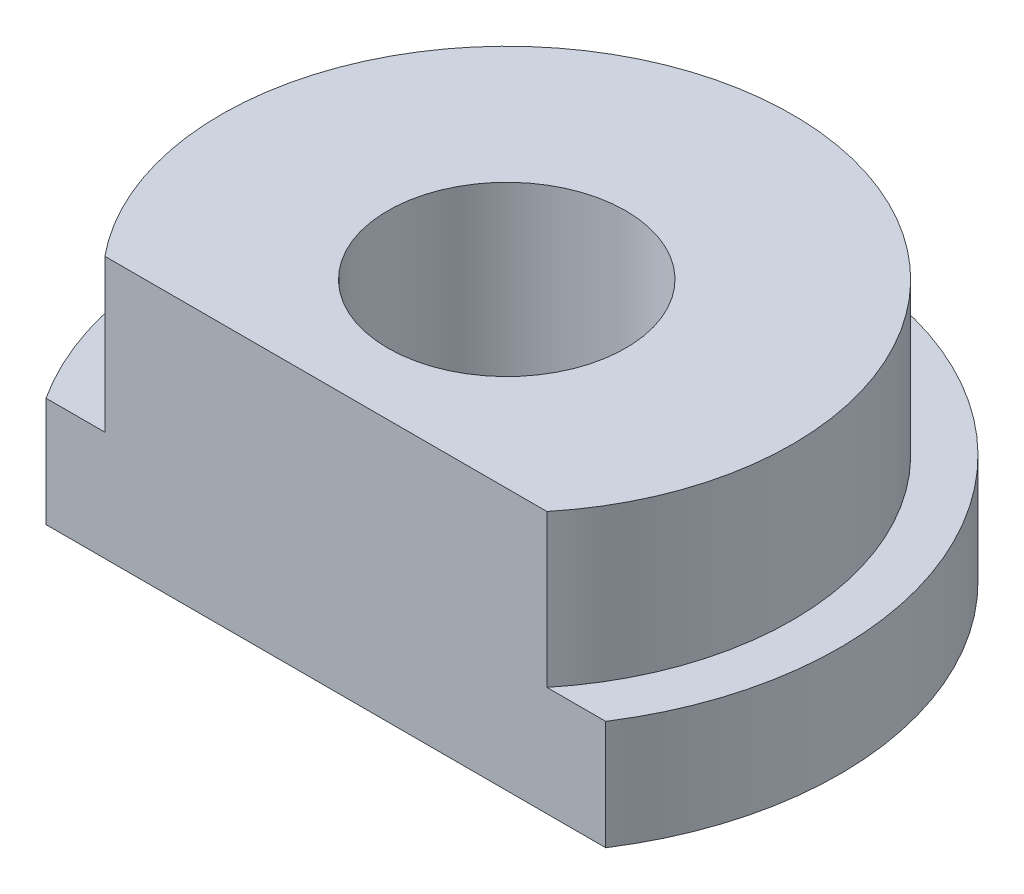
ISO-10303-21;
HEADER;
FILE_DESCRIPTION(('STEP AP214'),'2;1');
FILE_NAME('part.step','',(''),(''),'','','');
FILE_SCHEMA(('AUTOMOTIVE_DESIGN { 1 0 10303 214 1 1 1 1 }'));
ENDSEC;
DATA;
#1=APPLICATION_CONTEXT('core data for automotive mechanical design processes');
#2=APPLICATION_PROTOCOL_DEFINITION('international standard','automotive_design',2000,#1);
#3=PRODUCT_CONTEXT('',#1,'mechanical');
#4=PRODUCT('Part','Part','',(#3));
#5=PRODUCT_RELATED_PRODUCT_CATEGORY('part','',(#4));
#6=PRODUCT_DEFINITION_FORMATION('','',#4);
#7=PRODUCT_DEFINITION_CONTEXT('part definition',#1,'design');
#8=PRODUCT_DEFINITION('design','',#6,#7);
#9=PRODUCT_DEFINITION_SHAPE('','',#8);
#10=(LENGTH_UNIT() NAMED_UNIT(*) SI_UNIT(.MILLI.,.METRE.));
#11=(NAMED_UNIT(*) PLANE_ANGLE_UNIT() SI_UNIT($,.RADIAN.));
#12=(NAMED_UNIT(*) SI_UNIT($,.STERADIAN.) SOLID_ANGLE_UNIT());
#13=UNCERTAINTY_MEASURE_WITH_UNIT(LENGTH_MEASURE(1.E-05),#10,'distance_accuracy_value','');
#14=(GEOMETRIC_REPRESENTATION_CONTEXT(3) GLOBAL_UNCERTAINTY_ASSIGNED_CONTEXT((#13)) GLOBAL_UNIT_ASSIGNED_CONTEXT((#10,
#11,#12)) REPRESENTATION_CONTEXT('',''));
#15=CARTESIAN_POINT('',(0.,0.,0.));
#16=DIRECTION('',(0.,0.,1.));
#17=DIRECTION('',(1.,0.,0.));
#18=AXIS2_PLACEMENT_3D('',#15,#16,#17);
#19=CARTESIAN_POINT('',(3.5,0.,0.));
#20=DIRECTION('',(0.,-1.,0.));
#21=DIRECTION('',(0.,0.,-1.));
#22=AXIS2_PLACEMENT_3D('',#19,#20,#21);
#23=PLANE('',#22);
#24=DIRECTION('',(-1.,0.,0.));
#25=VECTOR('',#24,1.);
#26=CARTESIAN_POINT('',(-2.93938769133981,0.,1.9));
#27=LINE('',#26,#25);
#28=CARTESIAN_POINT('',(2.93938769133981,0.,1.9));
#29=VERTEX_POINT('',#28);
#30=CARTESIAN_POINT('',(-2.93938769133981,0.,1.9));
#31=VERTEX_POINT('',#30);
#32=EDGE_CURVE('E69',#29,#31,#27,.T.);
#33=ORIENTED_EDGE('',*,*,#32,.T.);
#34=CARTESIAN_POINT('',(0.,0.,0.));
#35=DIRECTION('',(0.,-1.,0.));
#36=DIRECTION('',(0.,0.,-1.));
#37=AXIS2_PLACEMENT_3D('',#34,#35,#36);
#38=CIRCLE('',#37,3.5);
#39=EDGE_CURVE('E82',#31,#29,#38,.T.);
#40=ORIENTED_EDGE('',*,*,#39,.T.);
#41=EDGE_LOOP('',(#33,#40));
#42=FACE_BOUND('',#41,.T.);
#43=CARTESIAN_POINT('',(0.,0.,0.));
#44=DIRECTION('',(0.,-1.,0.));
#45=DIRECTION('',(0.,0.,-1.));
#46=AXIS2_PLACEMENT_3D('',#43,#44,#45);
#47=CIRCLE('',#46,1.25);
#48=CARTESIAN_POINT('',(0.,0.,-1.25));
#49=VERTEX_POINT('',#48);
#50=EDGE_CURVE('E11',#49,#49,#47,.T.);
#51=ORIENTED_EDGE('',*,*,#50,.F.);
#52=EDGE_LOOP('',(#51));
#53=FACE_BOUND('',#52,.T.);
#54=ADVANCED_FACE('F32',(#42,#53),#23,.T.);
#55=CARTESIAN_POINT('',(0.,0.,0.));
#56=DIRECTION('',(0.,-1.,0.));
#57=DIRECTION('',(0.,0.,-1.));
#58=AXIS2_PLACEMENT_3D('',#55,#56,#57);
#59=CYLINDRICAL_SURFACE('',#58,1.25);
#60=ORIENTED_EDGE('',*,*,#50,.T.);
#61=EDGE_LOOP('',(#60));
#62=FACE_BOUND('',#61,.T.);
#63=CARTESIAN_POINT('',(0.,2.75,0.));
#64=DIRECTION('',(0.,-1.,0.));
#65=DIRECTION('',(0.,0.,-1.));
#66=AXIS2_PLACEMENT_3D('',#63,#64,#65);
#67=CIRCLE('',#66,1.25);
#68=CARTESIAN_POINT('',(0.,2.75,-1.25));
#69=VERTEX_POINT('',#68);
#70=EDGE_CURVE('E39',#69,#69,#67,.T.);
#71=ORIENTED_EDGE('',*,*,#70,.F.);
#72=EDGE_LOOP('',(#71));
#73=FACE_BOUND('',#72,.T.);
#74=ADVANCED_FACE('F103',(#62,#73),#59,.F.);
#75=CARTESIAN_POINT('',(1.25,2.75,0.));
#76=DIRECTION('',(0.,1.,0.));
#77=DIRECTION('',(0.,0.,1.));
#78=AXIS2_PLACEMENT_3D('',#75,#76,#77);
#79=PLANE('',#78);
#80=DIRECTION('',(-1.,0.,0.));
#81=VECTOR('',#80,1.);
#82=CARTESIAN_POINT('',(-2.93938769133981,2.75,1.9));
#83=LINE('',#82,#81);
#84=CARTESIAN_POINT('',(2.32163735324878,2.75,1.9));
#85=VERTEX_POINT('',#84);
#86=CARTESIAN_POINT('',(-2.32163735324878,2.75,1.9));
#87=VERTEX_POINT('',#86);
#88=EDGE_CURVE('E77',#85,#87,#83,.T.);
#89=ORIENTED_EDGE('',*,*,#88,.F.);
#90=CARTESIAN_POINT('',(0.,2.75,0.));
#91=DIRECTION('',(0.,-1.,0.));
#92=DIRECTION('',(0.,0.,-1.));
#93=AXIS2_PLACEMENT_3D('',#90,#91,#92);
#94=CIRCLE('',#93,3.);
#95=EDGE_CURVE('E96',#87,#85,#94,.T.);
#96=ORIENTED_EDGE('',*,*,#95,.F.);
#97=EDGE_LOOP('',(#89,#96));
#98=FACE_BOUND('',#97,.T.);
#99=ORIENTED_EDGE('',*,*,#70,.T.);
#100=EDGE_LOOP('',(#99));
#101=FACE_BOUND('',#100,.T.);
#102=ADVANCED_FACE('F101',(#98,#101),#79,.T.);
#103=CARTESIAN_POINT('',(0.,0.,0.));
#104=DIRECTION('',(0.,-1.,0.));
#105=DIRECTION('',(0.,0.,-1.));
#106=AXIS2_PLACEMENT_3D('',#103,#104,#105);
#107=CYLINDRICAL_SURFACE('',#106,3.);
#108=DIRECTION('',(0.,-1.,0.));
#109=VECTOR('',#108,1.);
#110=CARTESIAN_POINT('',(2.32163735324878,0.,1.9));
#111=LINE('',#110,#109);
#112=CARTESIAN_POINT('',(2.32163735324878,1.15,1.9));
#113=VERTEX_POINT('',#112);
#114=EDGE_CURVE('E87',#113,#85,#111,.F.);
#115=ORIENTED_EDGE('',*,*,#114,.F.);
#116=CARTESIAN_POINT('',(0.,1.15,0.));
#117=DIRECTION('',(0.,-1.,0.));
#118=DIRECTION('',(0.,0.,-1.));
#119=AXIS2_PLACEMENT_3D('',#116,#117,#118);
#120=CIRCLE('',#119,3.);
#121=CARTESIAN_POINT('',(-2.32163735324878,1.15,1.9));
#122=VERTEX_POINT('',#121);
#123=EDGE_CURVE('E89',#122,#113,#120,.T.);
#124=ORIENTED_EDGE('',*,*,#123,.F.);
#125=DIRECTION('',(0.,-1.,0.));
#126=VECTOR('',#125,1.);
#127=CARTESIAN_POINT('',(-2.32163735324878,0.,1.9));
#128=LINE('',#127,#126);
#129=EDGE_CURVE('E165',#87,#122,#128,.T.);
#130=ORIENTED_EDGE('',*,*,#129,.F.);
#131=ORIENTED_EDGE('',*,*,#95,.T.);
#132=EDGE_LOOP('',(#115,#124,#130,#131));
#133=FACE_BOUND('',#132,.T.);
#134=ADVANCED_FACE('F110',(#133),#107,.T.);
#135=CARTESIAN_POINT('',(3.,1.15,0.));
#136=DIRECTION('',(0.,1.,0.));
#137=DIRECTION('',(0.,0.,1.));
#138=AXIS2_PLACEMENT_3D('',#135,#136,#137);
#139=PLANE('',#138);
#140=DIRECTION('',(-1.,0.,0.));
#141=VECTOR('',#140,1.);
#142=CARTESIAN_POINT('',(3.,1.15,1.9));
#143=LINE('',#142,#141);
#144=CARTESIAN_POINT('',(2.93938769133981,1.15,1.9));
#145=VERTEX_POINT('',#144);
#146=EDGE_CURVE('E53',#145,#113,#143,.T.);
#147=ORIENTED_EDGE('',*,*,#146,.F.);
#148=CARTESIAN_POINT('',(0.,1.15,0.));
#149=DIRECTION('',(0.,-1.,0.));
#150=DIRECTION('',(0.,0.,-1.));
#151=AXIS2_PLACEMENT_3D('',#148,#149,#150);
#152=CIRCLE('',#151,3.5);
#153=CARTESIAN_POINT('',(-2.93938769133981,1.15,1.9));
#154=VERTEX_POINT('',#153);
#155=EDGE_CURVE('E84',#154,#145,#152,.T.);
#156=ORIENTED_EDGE('',*,*,#155,.F.);
#157=EDGE_CURVE('E46',#122,#154,#143,.T.);
#158=ORIENTED_EDGE('',*,*,#157,.F.);
#159=ORIENTED_EDGE('',*,*,#123,.T.);
#160=EDGE_LOOP('',(#147,#156,#158,#159));
#161=FACE_BOUND('',#160,.T.);
#162=ADVANCED_FACE('F116',(#161),#139,.T.);
#163=CARTESIAN_POINT('',(0.,0.,0.));
#164=DIRECTION('',(0.,-1.,0.));
#165=DIRECTION('',(0.,0.,-1.));
#166=AXIS2_PLACEMENT_3D('',#163,#164,#165);
#167=CYLINDRICAL_SURFACE('',#166,3.5);
#168=DIRECTION('',(0.,1.,0.));
#169=VECTOR('',#168,1.);
#170=CARTESIAN_POINT('',(2.93938769133981,0.,1.9));
#171=LINE('',#170,#169);
#172=EDGE_CURVE('E72',#29,#145,#171,.T.);
#173=ORIENTED_EDGE('',*,*,#172,.F.);
#174=ORIENTED_EDGE('',*,*,#39,.F.);
#175=DIRECTION('',(0.,1.,0.));
#176=VECTOR('',#175,1.);
#177=CARTESIAN_POINT('',(-2.93938769133981,0.,1.9));
#178=LINE('',#177,#176);
#179=EDGE_CURVE('E73',#31,#154,#178,.T.);
#180=ORIENTED_EDGE('',*,*,#179,.T.);
#181=ORIENTED_EDGE('',*,*,#155,.T.);
#182=EDGE_LOOP('',(#173,#174,#180,#181));
#183=FACE_BOUND('',#182,.T.);
#184=ADVANCED_FACE('F81',(#183),#167,.T.);
#185=CARTESIAN_POINT('',(-2.93938769133981,0.,1.9));
#186=DIRECTION('',(0.,0.,-1.));
#187=DIRECTION('',(-1.,0.,0.));
#188=AXIS2_PLACEMENT_3D('',#185,#186,#187);
#189=PLANE('',#188);
#190=ORIENTED_EDGE('',*,*,#114,.T.);
#191=ORIENTED_EDGE('',*,*,#88,.T.);
#192=ORIENTED_EDGE('',*,*,#129,.T.);
#193=ORIENTED_EDGE('',*,*,#157,.T.);
#194=ORIENTED_EDGE('',*,*,#179,.F.);
#195=ORIENTED_EDGE('',*,*,#32,.F.);
#196=ORIENTED_EDGE('',*,*,#172,.T.);
#197=ORIENTED_EDGE('',*,*,#146,.T.);
#198=EDGE_LOOP('',(#190,#191,#192,#193,#194,#195,#196,#197));
#199=FACE_BOUND('',#198,.T.);
#200=ADVANCED_FACE('F71',(#199),#189,.F.);
#201=CLOSED_SHELL('',(#54,#74,#102,#134,#162,#184,#200));
#202=MANIFOLD_SOLID_BREP('B2',#201);
#203=ADVANCED_BREP_SHAPE_REPRESENTATION('',(#18,#202),#14);
#204=SHAPE_DEFINITION_REPRESENTATION(#9,#203);
ENDSEC;
END-ISO-10303-21;
